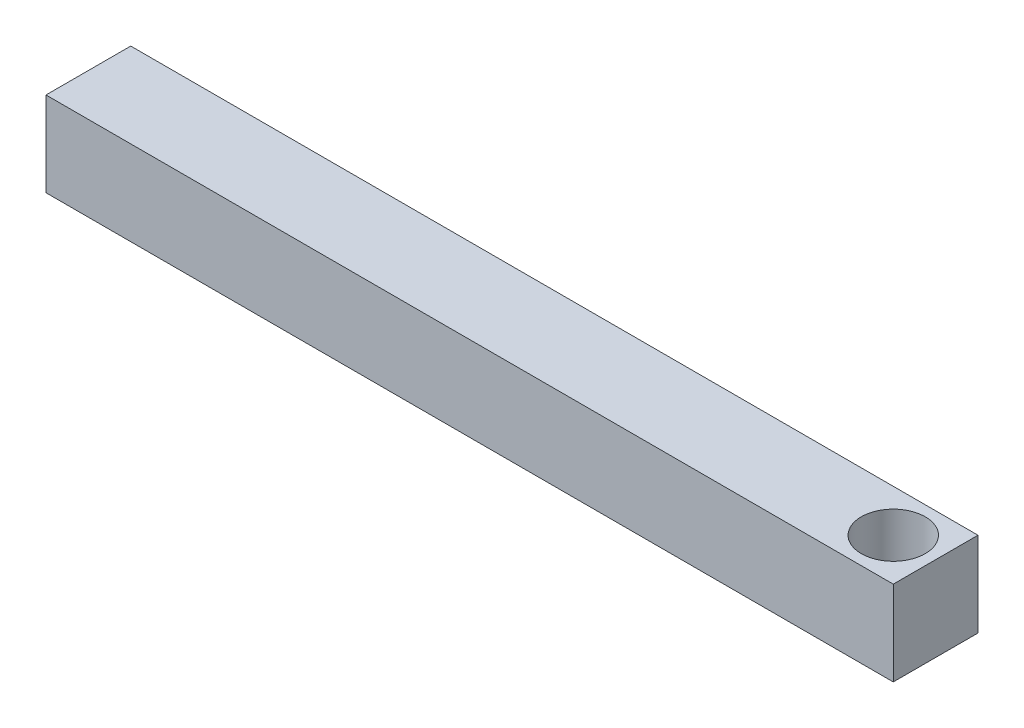
ISO-10303-21;
HEADER;
FILE_DESCRIPTION(('STEP AP214'),'2;1');
FILE_NAME('part.step','',(''),(''),'','','');
FILE_SCHEMA(('AUTOMOTIVE_DESIGN { 1 0 10303 214 1 1 1 1 }'));
ENDSEC;
DATA;
#1=APPLICATION_CONTEXT('core data for automotive mechanical design processes');
#2=APPLICATION_PROTOCOL_DEFINITION('international standard','automotive_design',2000,#1);
#3=PRODUCT_CONTEXT('',#1,'mechanical');
#4=PRODUCT('Part','Part','',(#3));
#5=PRODUCT_RELATED_PRODUCT_CATEGORY('part','',(#4));
#6=PRODUCT_DEFINITION_FORMATION('','',#4);
#7=PRODUCT_DEFINITION_CONTEXT('part definition',#1,'design');
#8=PRODUCT_DEFINITION('design','',#6,#7);
#9=PRODUCT_DEFINITION_SHAPE('','',#8);
#10=(LENGTH_UNIT() NAMED_UNIT(*) SI_UNIT(.MILLI.,.METRE.));
#11=(NAMED_UNIT(*) PLANE_ANGLE_UNIT() SI_UNIT($,.RADIAN.));
#12=(NAMED_UNIT(*) SI_UNIT($,.STERADIAN.) SOLID_ANGLE_UNIT());
#13=UNCERTAINTY_MEASURE_WITH_UNIT(LENGTH_MEASURE(1.E-05),#10,'distance_accuracy_value','');
#14=(GEOMETRIC_REPRESENTATION_CONTEXT(3) GLOBAL_UNCERTAINTY_ASSIGNED_CONTEXT((#13)) GLOBAL_UNIT_ASSIGNED_CONTEXT((#10,
#11,#12)) REPRESENTATION_CONTEXT('',''));
#15=CARTESIAN_POINT('',(0.,0.,0.));
#16=DIRECTION('',(0.,0.,1.));
#17=DIRECTION('',(1.,0.,0.));
#18=AXIS2_PLACEMENT_3D('',#15,#16,#17);
#19=CARTESIAN_POINT('',(-39.7875886854416,12.7,-8.68779626359327));
#20=DIRECTION('',(1.,0.,0.));
#21=DIRECTION('',(0.,0.,-1.));
#22=AXIS2_PLACEMENT_3D('',#19,#20,#21);
#23=PLANE('',#22);
#24=DIRECTION('',(0.,0.,1.));
#25=VECTOR('',#24,1.);
#26=CARTESIAN_POINT('',(-39.7875886854416,0.,-8.68779626359327));
#27=LINE('',#26,#25);
#28=CARTESIAN_POINT('',(-39.7875886854416,0.,-8.68779626359327));
#29=VERTEX_POINT('',#28);
#30=CARTESIAN_POINT('',(-39.7875886854416,0.,4.01220373640673));
#31=VERTEX_POINT('',#30);
#32=EDGE_CURVE('E96',#29,#31,#27,.T.);
#33=ORIENTED_EDGE('',*,*,#32,.T.);
#34=DIRECTION('',(0.,-1.,0.));
#35=VECTOR('',#34,1.);
#36=CARTESIAN_POINT('',(-39.7875886854416,12.7,4.01220373640673));
#37=LINE('',#36,#35);
#38=CARTESIAN_POINT('',(-39.7875886854416,12.7,4.01220373640673));
#39=VERTEX_POINT('',#38);
#40=EDGE_CURVE('E11',#39,#31,#37,.T.);
#41=ORIENTED_EDGE('',*,*,#40,.F.);
#42=DIRECTION('',(0.,0.,1.));
#43=VECTOR('',#42,1.);
#44=CARTESIAN_POINT('',(-39.7875886854416,12.7,-8.68779626359327));
#45=LINE('',#44,#43);
#46=CARTESIAN_POINT('',(-39.7875886854416,12.7,-8.68779626359327));
#47=VERTEX_POINT('',#46);
#48=EDGE_CURVE('E84',#47,#39,#45,.T.);
#49=ORIENTED_EDGE('',*,*,#48,.F.);
#50=DIRECTION('',(0.,-1.,0.));
#51=VECTOR('',#50,1.);
#52=CARTESIAN_POINT('',(-39.7875886854416,12.7,-8.68779626359327));
#53=LINE('',#52,#51);
#54=EDGE_CURVE('E92',#47,#29,#53,.T.);
#55=ORIENTED_EDGE('',*,*,#54,.T.);
#56=EDGE_LOOP('',(#33,#41,#49,#55));
#57=FACE_BOUND('',#56,.T.);
#58=ADVANCED_FACE('F33',(#57),#23,.F.);
#59=CARTESIAN_POINT('',(-39.7875886854416,12.7,4.01220373640673));
#60=DIRECTION('',(0.,0.,-1.));
#61=DIRECTION('',(-1.,0.,0.));
#62=AXIS2_PLACEMENT_3D('',#59,#60,#61);
#63=PLANE('',#62);
#64=DIRECTION('',(1.,0.,0.));
#65=VECTOR('',#64,1.);
#66=CARTESIAN_POINT('',(-39.7875886854416,0.,4.01220373640673));
#67=LINE('',#66,#65);
#68=CARTESIAN_POINT('',(87.2124113145584,0.,4.01220373640673));
#69=VERTEX_POINT('',#68);
#70=EDGE_CURVE('E88',#31,#69,#67,.T.);
#71=ORIENTED_EDGE('',*,*,#70,.T.);
#72=DIRECTION('',(0.,-1.,0.));
#73=VECTOR('',#72,1.);
#74=CARTESIAN_POINT('',(87.2124113145584,12.7,4.01220373640673));
#75=LINE('',#74,#73);
#76=CARTESIAN_POINT('',(87.2124113145584,12.7,4.01220373640673));
#77=VERTEX_POINT('',#76);
#78=EDGE_CURVE('E41',#77,#69,#75,.T.);
#79=ORIENTED_EDGE('',*,*,#78,.F.);
#80=DIRECTION('',(1.,0.,0.));
#81=VECTOR('',#80,1.);
#82=CARTESIAN_POINT('',(-39.7875886854416,12.7,4.01220373640673));
#83=LINE('',#82,#81);
#84=EDGE_CURVE('E79',#39,#77,#83,.T.);
#85=ORIENTED_EDGE('',*,*,#84,.F.);
#86=ORIENTED_EDGE('',*,*,#40,.T.);
#87=EDGE_LOOP('',(#71,#79,#85,#86));
#88=FACE_BOUND('',#87,.T.);
#89=ADVANCED_FACE('F87',(#88),#63,.F.);
#90=CARTESIAN_POINT('',(87.2124113145584,12.7,-8.68779626359327));
#91=DIRECTION('',(-1.,0.,0.));
#92=DIRECTION('',(0.,0.,1.));
#93=AXIS2_PLACEMENT_3D('',#90,#91,#92);
#94=PLANE('',#93);
#95=DIRECTION('',(0.,0.,-1.));
#96=VECTOR('',#95,1.);
#97=CARTESIAN_POINT('',(87.2124113145584,0.,-8.68779626359327));
#98=LINE('',#97,#96);
#99=CARTESIAN_POINT('',(87.2124113145584,0.,-8.68779626359327));
#100=VERTEX_POINT('',#99);
#101=EDGE_CURVE('E66',#69,#100,#98,.T.);
#102=ORIENTED_EDGE('',*,*,#101,.T.);
#103=DIRECTION('',(0.,-1.,0.));
#104=VECTOR('',#103,1.);
#105=CARTESIAN_POINT('',(87.2124113145584,12.7,-8.68779626359327));
#106=LINE('',#105,#104);
#107=CARTESIAN_POINT('',(87.2124113145584,12.7,-8.68779626359327));
#108=VERTEX_POINT('',#107);
#109=EDGE_CURVE('E89',#108,#100,#106,.T.);
#110=ORIENTED_EDGE('',*,*,#109,.F.);
#111=DIRECTION('',(0.,0.,-1.));
#112=VECTOR('',#111,1.);
#113=CARTESIAN_POINT('',(87.2124113145584,12.7,-8.68779626359327));
#114=LINE('',#113,#112);
#115=EDGE_CURVE('E82',#77,#108,#114,.T.);
#116=ORIENTED_EDGE('',*,*,#115,.F.);
#117=ORIENTED_EDGE('',*,*,#78,.T.);
#118=EDGE_LOOP('',(#102,#110,#116,#117));
#119=FACE_BOUND('',#118,.T.);
#120=ADVANCED_FACE('F90',(#119),#94,.F.);
#121=CARTESIAN_POINT('',(-39.7875886854416,12.7,-8.68779626359327));
#122=DIRECTION('',(0.,0.,1.));
#123=DIRECTION('',(1.,0.,0.));
#124=AXIS2_PLACEMENT_3D('',#121,#122,#123);
#125=PLANE('',#124);
#126=DIRECTION('',(-1.,0.,0.));
#127=VECTOR('',#126,1.);
#128=CARTESIAN_POINT('',(-39.7875886854416,0.,-8.68779626359327));
#129=LINE('',#128,#127);
#130=EDGE_CURVE('E72',#100,#29,#129,.T.);
#131=ORIENTED_EDGE('',*,*,#130,.T.);
#132=ORIENTED_EDGE('',*,*,#54,.F.);
#133=DIRECTION('',(-1.,0.,0.));
#134=VECTOR('',#133,1.);
#135=CARTESIAN_POINT('',(-39.7875886854416,12.7,-8.68779626359327));
#136=LINE('',#135,#134);
#137=EDGE_CURVE('E49',#108,#47,#136,.T.);
#138=ORIENTED_EDGE('',*,*,#137,.F.);
#139=ORIENTED_EDGE('',*,*,#109,.T.);
#140=EDGE_LOOP('',(#131,#132,#138,#139));
#141=FACE_BOUND('',#140,.T.);
#142=ADVANCED_FACE('F104',(#141),#125,.F.);
#143=CARTESIAN_POINT('',(0.,12.7,0.));
#144=DIRECTION('',(0.,1.,0.));
#145=DIRECTION('',(0.,0.,1.));
#146=AXIS2_PLACEMENT_3D('',#143,#144,#145);
#147=PLANE('',#146);
#148=CARTESIAN_POINT('',(80.8624113145584,12.7,-2.33779626359327));
#149=DIRECTION('',(0.,1.,0.));
#150=DIRECTION('',(0.,0.,1.));
#151=AXIS2_PLACEMENT_3D('',#148,#149,#150);
#152=CIRCLE('',#151,4.79426881615869);
#153=CARTESIAN_POINT('',(80.8624113145584,12.7,2.45647255256542));
#154=VERTEX_POINT('',#153);
#155=EDGE_CURVE('E110',#154,#154,#152,.T.);
#156=ORIENTED_EDGE('',*,*,#155,.F.);
#157=EDGE_LOOP('',(#156));
#158=FACE_BOUND('',#157,.T.);
#159=ORIENTED_EDGE('',*,*,#48,.T.);
#160=ORIENTED_EDGE('',*,*,#84,.T.);
#161=ORIENTED_EDGE('',*,*,#115,.T.);
#162=ORIENTED_EDGE('',*,*,#137,.T.);
#163=EDGE_LOOP('',(#159,#160,#161,#162));
#164=FACE_BOUND('',#163,.T.);
#165=ADVANCED_FACE('F80',(#158,#164),#147,.T.);
#166=CARTESIAN_POINT('',(0.,0.,0.));
#167=DIRECTION('',(0.,1.,0.));
#168=DIRECTION('',(0.,0.,1.));
#169=AXIS2_PLACEMENT_3D('',#166,#167,#168);
#170=PLANE('',#169);
#171=CARTESIAN_POINT('',(80.8624113145584,0.,-2.33779626359327));
#172=DIRECTION('',(0.,1.,0.));
#173=DIRECTION('',(0.,0.,1.));
#174=AXIS2_PLACEMENT_3D('',#171,#172,#173);
#175=CIRCLE('',#174,4.79426881615869);
#176=CARTESIAN_POINT('',(80.8624113145584,0.,2.45647255256542));
#177=VERTEX_POINT('',#176);
#178=EDGE_CURVE('E99',#177,#177,#175,.T.);
#179=ORIENTED_EDGE('',*,*,#178,.T.);
#180=EDGE_LOOP('',(#179));
#181=FACE_BOUND('',#180,.T.);
#182=ORIENTED_EDGE('',*,*,#32,.F.);
#183=ORIENTED_EDGE('',*,*,#130,.F.);
#184=ORIENTED_EDGE('',*,*,#101,.F.);
#185=ORIENTED_EDGE('',*,*,#70,.F.);
#186=EDGE_LOOP('',(#182,#183,#184,#185));
#187=FACE_BOUND('',#186,.T.);
#188=ADVANCED_FACE('F107',(#181,#187),#170,.F.);
#189=CARTESIAN_POINT('',(80.8624113145584,0.,-2.33779626359327));
#190=DIRECTION('',(0.,1.,0.));
#191=DIRECTION('',(0.,0.,1.));
#192=AXIS2_PLACEMENT_3D('',#189,#190,#191);
#193=CYLINDRICAL_SURFACE('',#192,4.79426881615869);
#194=ORIENTED_EDGE('',*,*,#178,.F.);
#195=EDGE_LOOP('',(#194));
#196=FACE_BOUND('',#195,.T.);
#197=ORIENTED_EDGE('',*,*,#155,.T.);
#198=EDGE_LOOP('',(#197));
#199=FACE_BOUND('',#198,.T.);
#200=ADVANCED_FACE('F117',(#196,#199),#193,.F.);
#201=CLOSED_SHELL('',(#58,#89,#120,#142,#165,#188,#200));
#202=MANIFOLD_SOLID_BREP('B2',#201);
#203=ADVANCED_BREP_SHAPE_REPRESENTATION('',(#18,#202),#14);
#204=SHAPE_DEFINITION_REPRESENTATION(#9,#203);
ENDSEC;
END-ISO-10303-21;
